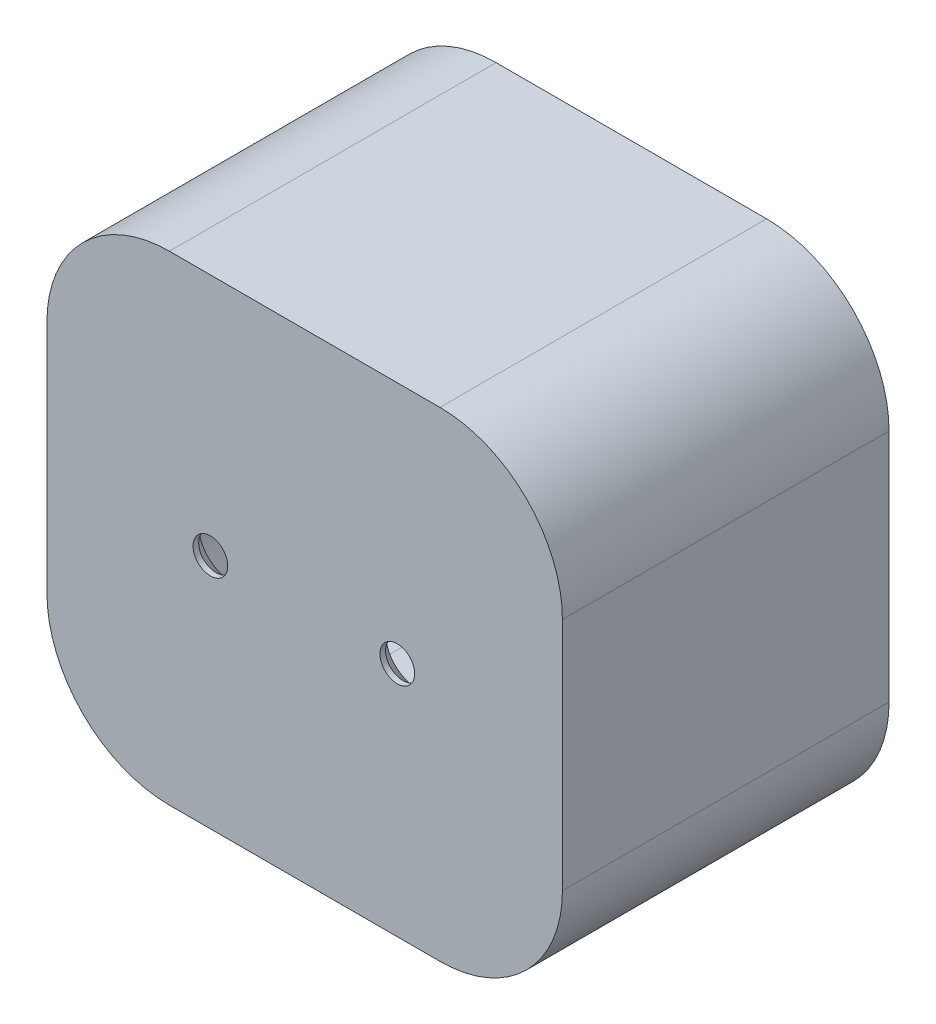
ISO-10303-21;
HEADER;
FILE_DESCRIPTION(('STEP AP214'),'2;1');
FILE_NAME('part.step','',(''),(''),'','','');
FILE_SCHEMA(('AUTOMOTIVE_DESIGN { 1 0 10303 214 1 1 1 1 }'));
ENDSEC;
DATA;
#1=APPLICATION_CONTEXT('core data for automotive mechanical design processes');
#2=APPLICATION_PROTOCOL_DEFINITION('international standard','automotive_design',2000,#1);
#3=PRODUCT_CONTEXT('',#1,'mechanical');
#4=PRODUCT('Part','Part','',(#3));
#5=PRODUCT_RELATED_PRODUCT_CATEGORY('part','',(#4));
#6=PRODUCT_DEFINITION_FORMATION('','',#4);
#7=PRODUCT_DEFINITION_CONTEXT('part definition',#1,'design');
#8=PRODUCT_DEFINITION('design','',#6,#7);
#9=PRODUCT_DEFINITION_SHAPE('','',#8);
#10=(LENGTH_UNIT() NAMED_UNIT(*) SI_UNIT(.MILLI.,.METRE.));
#11=(NAMED_UNIT(*) PLANE_ANGLE_UNIT() SI_UNIT($,.RADIAN.));
#12=(NAMED_UNIT(*) SI_UNIT($,.STERADIAN.) SOLID_ANGLE_UNIT());
#13=UNCERTAINTY_MEASURE_WITH_UNIT(LENGTH_MEASURE(1.E-05),#10,'distance_accuracy_value','');
#14=(GEOMETRIC_REPRESENTATION_CONTEXT(3) GLOBAL_UNCERTAINTY_ASSIGNED_CONTEXT((#13)) GLOBAL_UNIT_ASSIGNED_CONTEXT((#10,
#11,#12)) REPRESENTATION_CONTEXT('',''));
#15=CARTESIAN_POINT('',(0.,0.,0.));
#16=DIRECTION('',(0.,0.,1.));
#17=DIRECTION('',(1.,0.,0.));
#18=AXIS2_PLACEMENT_3D('',#15,#16,#17);
#19=CARTESIAN_POINT('',(-36.5,33.,30.));
#20=DIRECTION('',(0.,0.,-1.));
#21=DIRECTION('',(-1.,0.,0.));
#22=AXIS2_PLACEMENT_3D('',#19,#20,#21);
#23=CYLINDRICAL_SURFACE('',#22,12.);
#24=CARTESIAN_POINT('',(-36.5,33.,0.));
#25=DIRECTION('',(0.,0.,1.));
#26=DIRECTION('',(1.,0.,0.));
#27=AXIS2_PLACEMENT_3D('',#24,#25,#26);
#28=CIRCLE('',#27,12.);
#29=CARTESIAN_POINT('',(-36.4999999999999,45.,0.));
#30=VERTEX_POINT('',#29);
#31=CARTESIAN_POINT('',(-48.5,32.9999999999999,0.));
#32=VERTEX_POINT('',#31);
#33=EDGE_CURVE('E171',#30,#32,#28,.T.);
#34=ORIENTED_EDGE('',*,*,#33,.T.);
#35=DIRECTION('',(0.,0.,-1.));
#36=VECTOR('',#35,1.);
#37=CARTESIAN_POINT('',(-48.5,32.9999999999999,30.));
#38=LINE('',#37,#36);
#39=CARTESIAN_POINT('',(-48.5,32.9999999999999,32.));
#40=VERTEX_POINT('',#39);
#41=EDGE_CURVE('E11',#40,#32,#38,.T.);
#42=ORIENTED_EDGE('',*,*,#41,.F.);
#43=CARTESIAN_POINT('',(-36.5,33.,32.));
#44=DIRECTION('',(0.,0.,1.));
#45=DIRECTION('',(1.,0.,0.));
#46=AXIS2_PLACEMENT_3D('',#43,#44,#45);
#47=CIRCLE('',#46,12.);
#48=CARTESIAN_POINT('',(-36.4999999999999,45.,32.));
#49=VERTEX_POINT('',#48);
#50=EDGE_CURVE('E177',#49,#40,#47,.T.);
#51=ORIENTED_EDGE('',*,*,#50,.F.);
#52=DIRECTION('',(0.,0.,-1.));
#53=VECTOR('',#52,1.);
#54=CARTESIAN_POINT('',(-36.4999999999999,45.,30.));
#55=LINE('',#54,#53);
#56=EDGE_CURVE('E167',#49,#30,#55,.T.);
#57=ORIENTED_EDGE('',*,*,#56,.T.);
#58=EDGE_LOOP('',(#34,#42,#51,#57));
#59=FACE_BOUND('',#58,.T.);
#60=ADVANCED_FACE('F35',(#59),#23,.T.);
#61=CARTESIAN_POINT('',(-48.5,10.0000000000001,30.));
#62=DIRECTION('',(1.,0.,0.));
#63=DIRECTION('',(0.,0.,-1.));
#64=AXIS2_PLACEMENT_3D('',#61,#62,#63);
#65=PLANE('',#64);
#66=DIRECTION('',(0.,-1.,0.));
#67=VECTOR('',#66,1.);
#68=CARTESIAN_POINT('',(-48.5,10.0000000000001,0.));
#69=LINE('',#68,#67);
#70=CARTESIAN_POINT('',(-48.5,9.99999999999999,0.));
#71=VERTEX_POINT('',#70);
#72=EDGE_CURVE('E39',#32,#71,#69,.T.);
#73=ORIENTED_EDGE('',*,*,#72,.T.);
#74=DIRECTION('',(0.,0.,-1.));
#75=VECTOR('',#74,1.);
#76=CARTESIAN_POINT('',(-48.5,9.99999999999999,30.));
#77=LINE('',#76,#75);
#78=CARTESIAN_POINT('',(-48.5,9.99999999999999,32.));
#79=VERTEX_POINT('',#78);
#80=EDGE_CURVE('E44',#79,#71,#77,.T.);
#81=ORIENTED_EDGE('',*,*,#80,.F.);
#82=DIRECTION('',(0.,-1.,0.));
#83=VECTOR('',#82,1.);
#84=CARTESIAN_POINT('',(-48.5,10.0000000000001,32.));
#85=LINE('',#84,#83);
#86=EDGE_CURVE('E216',#40,#79,#85,.T.);
#87=ORIENTED_EDGE('',*,*,#86,.F.);
#88=ORIENTED_EDGE('',*,*,#41,.T.);
#89=EDGE_LOOP('',(#73,#81,#87,#88));
#90=FACE_BOUND('',#89,.T.);
#91=ADVANCED_FACE('F191',(#90),#65,.F.);
#92=CARTESIAN_POINT('',(-36.5,9.99999999999999,30.));
#93=DIRECTION('',(0.,0.,-1.));
#94=DIRECTION('',(-1.,0.,0.));
#95=AXIS2_PLACEMENT_3D('',#92,#93,#94);
#96=CYLINDRICAL_SURFACE('',#95,12.);
#97=CARTESIAN_POINT('',(-36.5,9.99999999999999,0.));
#98=DIRECTION('',(0.,0.,1.));
#99=DIRECTION('',(1.,0.,0.));
#100=AXIS2_PLACEMENT_3D('',#97,#98,#99);
#101=CIRCLE('',#100,12.);
#102=CARTESIAN_POINT('',(-36.4999999999999,-2.,0.));
#103=VERTEX_POINT('',#102);
#104=EDGE_CURVE('E184',#71,#103,#101,.T.);
#105=ORIENTED_EDGE('',*,*,#104,.T.);
#106=DIRECTION('',(0.,0.,1.));
#107=VECTOR('',#106,1.);
#108=CARTESIAN_POINT('',(-36.4999999999999,-2.00000000000001,30.));
#109=LINE('',#108,#107);
#110=CARTESIAN_POINT('',(-36.4999999999999,-2.00000000000001,32.));
#111=VERTEX_POINT('',#110);
#112=EDGE_CURVE('E196',#111,#103,#109,.F.);
#113=ORIENTED_EDGE('',*,*,#112,.F.);
#114=CARTESIAN_POINT('',(-36.5,9.99999999999999,32.));
#115=DIRECTION('',(0.,0.,1.));
#116=DIRECTION('',(1.,0.,0.));
#117=AXIS2_PLACEMENT_3D('',#114,#115,#116);
#118=CIRCLE('',#117,12.);
#119=EDGE_CURVE('E195',#79,#111,#118,.T.);
#120=ORIENTED_EDGE('',*,*,#119,.F.);
#121=ORIENTED_EDGE('',*,*,#80,.T.);
#122=EDGE_LOOP('',(#105,#113,#120,#121));
#123=FACE_BOUND('',#122,.T.);
#124=ADVANCED_FACE('F194',(#123),#96,.T.);
#125=CARTESIAN_POINT('',(-10.0000000000001,-2.,30.));
#126=DIRECTION('',(0.,1.,0.));
#127=DIRECTION('',(-1.,0.,0.));
#128=AXIS2_PLACEMENT_3D('',#125,#126,#127);
#129=PLANE('',#128);
#130=DIRECTION('',(1.,0.,0.));
#131=VECTOR('',#130,1.);
#132=CARTESIAN_POINT('',(-10.0000000000001,-2.,0.));
#133=LINE('',#132,#131);
#134=CARTESIAN_POINT('',(-10.0000000000001,-2.,0.));
#135=VERTEX_POINT('',#134);
#136=EDGE_CURVE('E183',#103,#135,#133,.T.);
#137=ORIENTED_EDGE('',*,*,#136,.T.);
#138=DIRECTION('',(0.,0.,-1.));
#139=VECTOR('',#138,1.);
#140=CARTESIAN_POINT('',(-10.0000000000001,-2.,30.));
#141=LINE('',#140,#139);
#142=CARTESIAN_POINT('',(-10.0000000000001,-2.,32.));
#143=VERTEX_POINT('',#142);
#144=EDGE_CURVE('E206',#143,#135,#141,.T.);
#145=ORIENTED_EDGE('',*,*,#144,.F.);
#146=DIRECTION('',(1.,0.,0.));
#147=VECTOR('',#146,1.);
#148=CARTESIAN_POINT('',(-10.0000000000001,-2.,32.));
#149=LINE('',#148,#147);
#150=EDGE_CURVE('E214',#111,#143,#149,.T.);
#151=ORIENTED_EDGE('',*,*,#150,.F.);
#152=ORIENTED_EDGE('',*,*,#112,.T.);
#153=EDGE_LOOP('',(#137,#145,#151,#152));
#154=FACE_BOUND('',#153,.T.);
#155=ADVANCED_FACE('F204',(#154),#129,.F.);
#156=CARTESIAN_POINT('',(-10.,10.,30.));
#157=DIRECTION('',(0.,0.,-1.));
#158=DIRECTION('',(-1.,0.,0.));
#159=AXIS2_PLACEMENT_3D('',#156,#157,#158);
#160=CYLINDRICAL_SURFACE('',#159,12.);
#161=CARTESIAN_POINT('',(-10.,10.,0.));
#162=DIRECTION('',(0.,0.,1.));
#163=DIRECTION('',(1.,0.,0.));
#164=AXIS2_PLACEMENT_3D('',#161,#162,#163);
#165=CIRCLE('',#164,12.);
#166=CARTESIAN_POINT('',(2.,10.0000000000001,0.));
#167=VERTEX_POINT('',#166);
#168=EDGE_CURVE('E181',#135,#167,#165,.T.);
#169=ORIENTED_EDGE('',*,*,#168,.T.);
#170=DIRECTION('',(0.,0.,1.));
#171=VECTOR('',#170,1.);
#172=CARTESIAN_POINT('',(2.,10.0000000000001,30.));
#173=LINE('',#172,#171);
#174=CARTESIAN_POINT('',(2.,10.0000000000001,32.));
#175=VERTEX_POINT('',#174);
#176=EDGE_CURVE('E161',#175,#167,#173,.F.);
#177=ORIENTED_EDGE('',*,*,#176,.F.);
#178=CARTESIAN_POINT('',(-10.,10.,32.));
#179=DIRECTION('',(0.,0.,1.));
#180=DIRECTION('',(1.,0.,0.));
#181=AXIS2_PLACEMENT_3D('',#178,#179,#180);
#182=CIRCLE('',#181,12.);
#183=EDGE_CURVE('E149',#143,#175,#182,.T.);
#184=ORIENTED_EDGE('',*,*,#183,.F.);
#185=ORIENTED_EDGE('',*,*,#144,.T.);
#186=EDGE_LOOP('',(#169,#177,#184,#185));
#187=FACE_BOUND('',#186,.T.);
#188=ADVANCED_FACE('F208',(#187),#160,.T.);
#189=CARTESIAN_POINT('',(2.,10.0000000000001,30.));
#190=DIRECTION('',(-1.,0.,0.));
#191=DIRECTION('',(0.,0.,1.));
#192=AXIS2_PLACEMENT_3D('',#189,#190,#191);
#193=PLANE('',#192);
#194=DIRECTION('',(0.,1.,0.));
#195=VECTOR('',#194,1.);
#196=CARTESIAN_POINT('',(2.,10.0000000000001,0.));
#197=LINE('',#196,#195);
#198=CARTESIAN_POINT('',(2.,32.9999999999999,0.));
#199=VERTEX_POINT('',#198);
#200=EDGE_CURVE('E158',#167,#199,#197,.T.);
#201=ORIENTED_EDGE('',*,*,#200,.T.);
#202=DIRECTION('',(0.,0.,-1.));
#203=VECTOR('',#202,1.);
#204=CARTESIAN_POINT('',(2.,32.9999999999999,30.));
#205=LINE('',#204,#203);
#206=CARTESIAN_POINT('',(2.,32.9999999999999,32.));
#207=VERTEX_POINT('',#206);
#208=EDGE_CURVE('E155',#207,#199,#205,.T.);
#209=ORIENTED_EDGE('',*,*,#208,.F.);
#210=DIRECTION('',(0.,1.,0.));
#211=VECTOR('',#210,1.);
#212=CARTESIAN_POINT('',(2.,10.0000000000001,32.));
#213=LINE('',#212,#211);
#214=EDGE_CURVE('E143',#175,#207,#213,.T.);
#215=ORIENTED_EDGE('',*,*,#214,.F.);
#216=ORIENTED_EDGE('',*,*,#176,.T.);
#217=EDGE_LOOP('',(#201,#209,#215,#216));
#218=FACE_BOUND('',#217,.T.);
#219=ADVANCED_FACE('F156',(#218),#193,.F.);
#220=CARTESIAN_POINT('',(-10.,33.,30.));
#221=DIRECTION('',(0.,0.,-1.));
#222=DIRECTION('',(-1.,0.,0.));
#223=AXIS2_PLACEMENT_3D('',#220,#221,#222);
#224=CYLINDRICAL_SURFACE('',#223,12.);
#225=CARTESIAN_POINT('',(-10.,33.,0.));
#226=DIRECTION('',(0.,0.,1.));
#227=DIRECTION('',(1.,0.,0.));
#228=AXIS2_PLACEMENT_3D('',#225,#226,#227);
#229=CIRCLE('',#228,12.);
#230=CARTESIAN_POINT('',(-10.0000000000001,45.,0.));
#231=VERTEX_POINT('',#230);
#232=EDGE_CURVE('E178',#199,#231,#229,.T.);
#233=ORIENTED_EDGE('',*,*,#232,.T.);
#234=DIRECTION('',(0.,0.,1.));
#235=VECTOR('',#234,1.);
#236=CARTESIAN_POINT('',(-10.0000000000001,45.,30.));
#237=LINE('',#236,#235);
#238=CARTESIAN_POINT('',(-10.0000000000001,45.,32.));
#239=VERTEX_POINT('',#238);
#240=EDGE_CURVE('E162',#239,#231,#237,.F.);
#241=ORIENTED_EDGE('',*,*,#240,.F.);
#242=CARTESIAN_POINT('',(-10.,33.,32.));
#243=DIRECTION('',(0.,0.,1.));
#244=DIRECTION('',(1.,0.,0.));
#245=AXIS2_PLACEMENT_3D('',#242,#243,#244);
#246=CIRCLE('',#245,12.);
#247=EDGE_CURVE('E146',#207,#239,#246,.T.);
#248=ORIENTED_EDGE('',*,*,#247,.F.);
#249=ORIENTED_EDGE('',*,*,#208,.T.);
#250=EDGE_LOOP('',(#233,#241,#248,#249));
#251=FACE_BOUND('',#250,.T.);
#252=ADVANCED_FACE('F164',(#251),#224,.T.);
#253=CARTESIAN_POINT('',(-10.0000000000001,45.,30.));
#254=DIRECTION('',(0.,-1.,0.));
#255=DIRECTION('',(1.,0.,0.));
#256=AXIS2_PLACEMENT_3D('',#253,#254,#255);
#257=PLANE('',#256);
#258=DIRECTION('',(-1.,0.,0.));
#259=VECTOR('',#258,1.);
#260=CARTESIAN_POINT('',(-10.0000000000001,45.,0.));
#261=LINE('',#260,#259);
#262=EDGE_CURVE('E175',#231,#30,#261,.T.);
#263=ORIENTED_EDGE('',*,*,#262,.T.);
#264=ORIENTED_EDGE('',*,*,#56,.F.);
#265=DIRECTION('',(-1.,0.,0.));
#266=VECTOR('',#265,1.);
#267=CARTESIAN_POINT('',(-10.0000000000001,45.,32.));
#268=LINE('',#267,#266);
#269=EDGE_CURVE('E61',#239,#49,#268,.T.);
#270=ORIENTED_EDGE('',*,*,#269,.F.);
#271=ORIENTED_EDGE('',*,*,#240,.T.);
#272=EDGE_LOOP('',(#263,#264,#270,#271));
#273=FACE_BOUND('',#272,.T.);
#274=ADVANCED_FACE('F378',(#273),#257,.F.);
#275=CARTESIAN_POINT('',(-36.5,33.,32.));
#276=DIRECTION('',(0.,0.,1.));
#277=DIRECTION('',(1.,0.,0.));
#278=AXIS2_PLACEMENT_3D('',#275,#276,#277);
#279=PLANE('',#278);
#280=CARTESIAN_POINT('',(-32.4851185797025,21.1581560329257,32.));
#281=DIRECTION('',(0.,0.,-1.));
#282=DIRECTION('',(-1.,0.,0.));
#283=AXIS2_PLACEMENT_3D('',#280,#281,#282);
#284=CIRCLE('',#283,1.7);
#285=CARTESIAN_POINT('',(-34.1851185797025,21.1581560329257,32.));
#286=VERTEX_POINT('',#285);
#287=EDGE_CURVE('E290',#286,#286,#284,.T.);
#288=ORIENTED_EDGE('',*,*,#287,.T.);
#289=EDGE_LOOP('',(#288));
#290=FACE_BOUND('',#289,.T.);
#291=CARTESIAN_POINT('',(-14.1764307757685,21.1581560329257,32.));
#292=DIRECTION('',(0.,0.,-1.));
#293=DIRECTION('',(-1.,0.,0.));
#294=AXIS2_PLACEMENT_3D('',#291,#292,#293);
#295=CIRCLE('',#294,1.7);
#296=CARTESIAN_POINT('',(-15.8764307757685,21.1581560329257,32.));
#297=VERTEX_POINT('',#296);
#298=EDGE_CURVE('E261',#297,#297,#295,.T.);
#299=ORIENTED_EDGE('',*,*,#298,.T.);
#300=EDGE_LOOP('',(#299));
#301=FACE_BOUND('',#300,.T.);
#302=ORIENTED_EDGE('',*,*,#50,.T.);
#303=ORIENTED_EDGE('',*,*,#86,.T.);
#304=ORIENTED_EDGE('',*,*,#119,.T.);
#305=ORIENTED_EDGE('',*,*,#150,.T.);
#306=ORIENTED_EDGE('',*,*,#183,.T.);
#307=ORIENTED_EDGE('',*,*,#214,.T.);
#308=ORIENTED_EDGE('',*,*,#247,.T.);
#309=ORIENTED_EDGE('',*,*,#269,.T.);
#310=EDGE_LOOP('',(#302,#303,#304,#305,#306,#307,#308,#309));
#311=FACE_BOUND('',#310,.T.);
#312=ADVANCED_FACE('F37',(#290,#301,#311),#279,.T.);
#313=CARTESIAN_POINT('',(-36.5,33.,0.));
#314=DIRECTION('',(0.,0.,1.));
#315=DIRECTION('',(1.,0.,0.));
#316=AXIS2_PLACEMENT_3D('',#313,#314,#315);
#317=PLANE('',#316);
#318=DIRECTION('',(-1.,0.,0.));
#319=VECTOR('',#318,1.);
#320=CARTESIAN_POINT('',(-10.0000000000001,43.,0.));
#321=LINE('',#320,#319);
#322=CARTESIAN_POINT('',(-10.0000000000001,43.,0.));
#323=VERTEX_POINT('',#322);
#324=CARTESIAN_POINT('',(-36.4999999999999,43.,0.));
#325=VERTEX_POINT('',#324);
#326=EDGE_CURVE('E238',#323,#325,#321,.T.);
#327=ORIENTED_EDGE('',*,*,#326,.T.);
#328=CARTESIAN_POINT('',(-36.5,33.,0.));
#329=DIRECTION('',(0.,0.,1.));
#330=DIRECTION('',(1.,0.,0.));
#331=AXIS2_PLACEMENT_3D('',#328,#329,#330);
#332=CIRCLE('',#331,10.);
#333=CARTESIAN_POINT('',(-46.5,32.9999999999999,0.));
#334=VERTEX_POINT('',#333);
#335=EDGE_CURVE('E258',#325,#334,#332,.T.);
#336=ORIENTED_EDGE('',*,*,#335,.T.);
#337=DIRECTION('',(0.,-1.,0.));
#338=VECTOR('',#337,1.);
#339=CARTESIAN_POINT('',(-46.5,10.0000000000001,0.));
#340=LINE('',#339,#338);
#341=CARTESIAN_POINT('',(-46.5,9.99999999999999,0.));
#342=VERTEX_POINT('',#341);
#343=EDGE_CURVE('E255',#334,#342,#340,.T.);
#344=ORIENTED_EDGE('',*,*,#343,.T.);
#345=CARTESIAN_POINT('',(-36.5,9.99999999999999,0.));
#346=DIRECTION('',(0.,0.,1.));
#347=DIRECTION('',(-1.,0.,0.));
#348=AXIS2_PLACEMENT_3D('',#345,#346,#347);
#349=CIRCLE('',#348,10.);
#350=CARTESIAN_POINT('',(-36.4999999999999,0.,0.));
#351=VERTEX_POINT('',#350);
#352=EDGE_CURVE('E52',#342,#351,#349,.T.);
#353=ORIENTED_EDGE('',*,*,#352,.T.);
#354=DIRECTION('',(1.,0.,0.));
#355=VECTOR('',#354,1.);
#356=CARTESIAN_POINT('',(-10.0000000000001,0.,0.));
#357=LINE('',#356,#355);
#358=CARTESIAN_POINT('',(-10.0000000000001,0.,0.));
#359=VERTEX_POINT('',#358);
#360=EDGE_CURVE('E251',#351,#359,#357,.T.);
#361=ORIENTED_EDGE('',*,*,#360,.T.);
#362=CARTESIAN_POINT('',(-10.,10.,0.));
#363=DIRECTION('',(0.,0.,1.));
#364=DIRECTION('',(1.,0.,0.));
#365=AXIS2_PLACEMENT_3D('',#362,#363,#364);
#366=CIRCLE('',#365,10.);
#367=CARTESIAN_POINT('',(0.,10.0000000000001,0.));
#368=VERTEX_POINT('',#367);
#369=EDGE_CURVE('E248',#359,#368,#366,.T.);
#370=ORIENTED_EDGE('',*,*,#369,.T.);
#371=DIRECTION('',(0.,1.,0.));
#372=VECTOR('',#371,1.);
#373=CARTESIAN_POINT('',(0.,10.0000000000001,0.));
#374=LINE('',#373,#372);
#375=CARTESIAN_POINT('',(0.,32.9999999999999,0.));
#376=VERTEX_POINT('',#375);
#377=EDGE_CURVE('E245',#368,#376,#374,.T.);
#378=ORIENTED_EDGE('',*,*,#377,.T.);
#379=CARTESIAN_POINT('',(-10.,33.,0.));
#380=DIRECTION('',(0.,0.,1.));
#381=DIRECTION('',(1.,0.,0.));
#382=AXIS2_PLACEMENT_3D('',#379,#380,#381);
#383=CIRCLE('',#382,10.);
#384=EDGE_CURVE('E242',#376,#323,#383,.T.);
#385=ORIENTED_EDGE('',*,*,#384,.T.);
#386=EDGE_LOOP('',(#327,#336,#344,#353,#361,#370,#378,#385));
#387=FACE_BOUND('',#386,.T.);
#388=ORIENTED_EDGE('',*,*,#33,.F.);
#389=ORIENTED_EDGE('',*,*,#262,.F.);
#390=ORIENTED_EDGE('',*,*,#232,.F.);
#391=ORIENTED_EDGE('',*,*,#200,.F.);
#392=ORIENTED_EDGE('',*,*,#168,.F.);
#393=ORIENTED_EDGE('',*,*,#136,.F.);
#394=ORIENTED_EDGE('',*,*,#104,.F.);
#395=ORIENTED_EDGE('',*,*,#72,.F.);
#396=EDGE_LOOP('',(#388,#389,#390,#391,#392,#393,#394,#395));
#397=FACE_BOUND('',#396,.T.);
#398=ADVANCED_FACE('F199',(#387,#397),#317,.F.);
#399=CARTESIAN_POINT('',(-36.5,33.,30.));
#400=DIRECTION('',(0.,0.,-1.));
#401=DIRECTION('',(-1.,0.,0.));
#402=AXIS2_PLACEMENT_3D('',#399,#400,#401);
#403=CYLINDRICAL_SURFACE('',#402,10.);
#404=ORIENTED_EDGE('',*,*,#335,.F.);
#405=DIRECTION('',(0.,0.,-1.));
#406=VECTOR('',#405,1.);
#407=CARTESIAN_POINT('',(-36.4999999999999,43.,30.));
#408=LINE('',#407,#406);
#409=CARTESIAN_POINT('',(-36.4999999999999,43.,30.));
#410=VERTEX_POINT('',#409);
#411=EDGE_CURVE('E236',#410,#325,#408,.T.);
#412=ORIENTED_EDGE('',*,*,#411,.F.);
#413=CARTESIAN_POINT('',(-36.5,33.,30.));
#414=DIRECTION('',(0.,0.,1.));
#415=DIRECTION('',(1.,0.,0.));
#416=AXIS2_PLACEMENT_3D('',#413,#414,#415);
#417=CIRCLE('',#416,10.);
#418=CARTESIAN_POINT('',(-46.5,32.9999999999999,30.));
#419=VERTEX_POINT('',#418);
#420=EDGE_CURVE('E241',#410,#419,#417,.T.);
#421=ORIENTED_EDGE('',*,*,#420,.T.);
#422=DIRECTION('',(0.,0.,-1.));
#423=VECTOR('',#422,1.);
#424=CARTESIAN_POINT('',(-46.5,32.9999999999999,30.));
#425=LINE('',#424,#423);
#426=EDGE_CURVE('E174',#419,#334,#425,.T.);
#427=ORIENTED_EDGE('',*,*,#426,.T.);
#428=EDGE_LOOP('',(#404,#412,#421,#427));
#429=FACE_BOUND('',#428,.T.);
#430=ADVANCED_FACE('F317',(#429),#403,.F.);
#431=CARTESIAN_POINT('',(-46.5,10.0000000000001,30.));
#432=DIRECTION('',(1.,0.,0.));
#433=DIRECTION('',(0.,0.,-1.));
#434=AXIS2_PLACEMENT_3D('',#431,#432,#433);
#435=PLANE('',#434);
#436=ORIENTED_EDGE('',*,*,#343,.F.);
#437=ORIENTED_EDGE('',*,*,#426,.F.);
#438=DIRECTION('',(0.,-1.,0.));
#439=VECTOR('',#438,1.);
#440=CARTESIAN_POINT('',(-46.5,10.0000000000001,30.));
#441=LINE('',#440,#439);
#442=CARTESIAN_POINT('',(-46.5,9.99999999999999,30.));
#443=VERTEX_POINT('',#442);
#444=EDGE_CURVE('E277',#419,#443,#441,.T.);
#445=ORIENTED_EDGE('',*,*,#444,.T.);
#446=DIRECTION('',(0.,0.,-1.));
#447=VECTOR('',#446,1.);
#448=CARTESIAN_POINT('',(-46.5,9.99999999999999,30.));
#449=LINE('',#448,#447);
#450=EDGE_CURVE('E224',#443,#342,#449,.T.);
#451=ORIENTED_EDGE('',*,*,#450,.T.);
#452=EDGE_LOOP('',(#436,#437,#445,#451));
#453=FACE_BOUND('',#452,.T.);
#454=ADVANCED_FACE('F321',(#453),#435,.T.);
#455=CARTESIAN_POINT('',(-36.5,9.99999999999999,30.));
#456=DIRECTION('',(0.,0.,-1.));
#457=DIRECTION('',(-1.,0.,0.));
#458=AXIS2_PLACEMENT_3D('',#455,#456,#457);
#459=CYLINDRICAL_SURFACE('',#458,10.);
#460=ORIENTED_EDGE('',*,*,#352,.F.);
#461=ORIENTED_EDGE('',*,*,#450,.F.);
#462=CARTESIAN_POINT('',(-36.5,9.99999999999999,30.));
#463=DIRECTION('',(0.,0.,1.));
#464=DIRECTION('',(-1.,0.,0.));
#465=AXIS2_PLACEMENT_3D('',#462,#463,#464);
#466=CIRCLE('',#465,10.);
#467=CARTESIAN_POINT('',(-36.4999999999999,0.,30.));
#468=VERTEX_POINT('',#467);
#469=EDGE_CURVE('E274',#443,#468,#466,.T.);
#470=ORIENTED_EDGE('',*,*,#469,.T.);
#471=DIRECTION('',(0.,0.,-1.));
#472=VECTOR('',#471,1.);
#473=CARTESIAN_POINT('',(-36.4999999999999,0.,30.));
#474=LINE('',#473,#472);
#475=EDGE_CURVE('E226',#468,#351,#474,.T.);
#476=ORIENTED_EDGE('',*,*,#475,.T.);
#477=EDGE_LOOP('',(#460,#461,#470,#476));
#478=FACE_BOUND('',#477,.T.);
#479=ADVANCED_FACE('F340',(#478),#459,.F.);
#480=CARTESIAN_POINT('',(-10.0000000000001,0.,30.));
#481=DIRECTION('',(0.,1.,0.));
#482=DIRECTION('',(-1.,0.,0.));
#483=AXIS2_PLACEMENT_3D('',#480,#481,#482);
#484=PLANE('',#483);
#485=ORIENTED_EDGE('',*,*,#360,.F.);
#486=ORIENTED_EDGE('',*,*,#475,.F.);
#487=DIRECTION('',(1.,0.,0.));
#488=VECTOR('',#487,1.);
#489=CARTESIAN_POINT('',(-10.0000000000001,0.,30.));
#490=LINE('',#489,#488);
#491=CARTESIAN_POINT('',(-10.0000000000001,0.,30.));
#492=VERTEX_POINT('',#491);
#493=EDGE_CURVE('E271',#468,#492,#490,.T.);
#494=ORIENTED_EDGE('',*,*,#493,.T.);
#495=DIRECTION('',(0.,0.,-1.));
#496=VECTOR('',#495,1.);
#497=CARTESIAN_POINT('',(-10.0000000000001,0.,30.));
#498=LINE('',#497,#496);
#499=EDGE_CURVE('E228',#492,#359,#498,.T.);
#500=ORIENTED_EDGE('',*,*,#499,.T.);
#501=EDGE_LOOP('',(#485,#486,#494,#500));
#502=FACE_BOUND('',#501,.T.);
#503=ADVANCED_FACE('F344',(#502),#484,.T.);
#504=CARTESIAN_POINT('',(-10.,10.,30.));
#505=DIRECTION('',(0.,0.,-1.));
#506=DIRECTION('',(-1.,0.,0.));
#507=AXIS2_PLACEMENT_3D('',#504,#505,#506);
#508=CYLINDRICAL_SURFACE('',#507,10.);
#509=ORIENTED_EDGE('',*,*,#369,.F.);
#510=ORIENTED_EDGE('',*,*,#499,.F.);
#511=CARTESIAN_POINT('',(-10.,10.,30.));
#512=DIRECTION('',(0.,0.,1.));
#513=DIRECTION('',(1.,0.,0.));
#514=AXIS2_PLACEMENT_3D('',#511,#512,#513);
#515=CIRCLE('',#514,10.);
#516=CARTESIAN_POINT('',(0.,10.0000000000001,30.));
#517=VERTEX_POINT('',#516);
#518=EDGE_CURVE('E268',#492,#517,#515,.T.);
#519=ORIENTED_EDGE('',*,*,#518,.T.);
#520=DIRECTION('',(0.,0.,-1.));
#521=VECTOR('',#520,1.);
#522=CARTESIAN_POINT('',(0.,10.0000000000001,30.));
#523=LINE('',#522,#521);
#524=EDGE_CURVE('E230',#517,#368,#523,.T.);
#525=ORIENTED_EDGE('',*,*,#524,.T.);
#526=EDGE_LOOP('',(#509,#510,#519,#525));
#527=FACE_BOUND('',#526,.T.);
#528=ADVANCED_FACE('F348',(#527),#508,.F.);
#529=CARTESIAN_POINT('',(0.,10.0000000000001,30.));
#530=DIRECTION('',(-1.,0.,0.));
#531=DIRECTION('',(0.,0.,1.));
#532=AXIS2_PLACEMENT_3D('',#529,#530,#531);
#533=PLANE('',#532);
#534=ORIENTED_EDGE('',*,*,#377,.F.);
#535=ORIENTED_EDGE('',*,*,#524,.F.);
#536=DIRECTION('',(0.,1.,0.));
#537=VECTOR('',#536,1.);
#538=CARTESIAN_POINT('',(0.,10.0000000000001,30.));
#539=LINE('',#538,#537);
#540=CARTESIAN_POINT('',(0.,32.9999999999999,30.));
#541=VERTEX_POINT('',#540);
#542=EDGE_CURVE('E265',#517,#541,#539,.T.);
#543=ORIENTED_EDGE('',*,*,#542,.T.);
#544=DIRECTION('',(0.,0.,-1.));
#545=VECTOR('',#544,1.);
#546=CARTESIAN_POINT('',(0.,32.9999999999999,30.));
#547=LINE('',#546,#545);
#548=EDGE_CURVE('E232',#541,#376,#547,.T.);
#549=ORIENTED_EDGE('',*,*,#548,.T.);
#550=EDGE_LOOP('',(#534,#535,#543,#549));
#551=FACE_BOUND('',#550,.T.);
#552=ADVANCED_FACE('F350',(#551),#533,.T.);
#553=CARTESIAN_POINT('',(-10.,33.,30.));
#554=DIRECTION('',(0.,0.,-1.));
#555=DIRECTION('',(-1.,0.,0.));
#556=AXIS2_PLACEMENT_3D('',#553,#554,#555);
#557=CYLINDRICAL_SURFACE('',#556,10.);
#558=ORIENTED_EDGE('',*,*,#384,.F.);
#559=ORIENTED_EDGE('',*,*,#548,.F.);
#560=CARTESIAN_POINT('',(-10.,33.,30.));
#561=DIRECTION('',(0.,0.,1.));
#562=DIRECTION('',(1.,0.,0.));
#563=AXIS2_PLACEMENT_3D('',#560,#561,#562);
#564=CIRCLE('',#563,10.);
#565=CARTESIAN_POINT('',(-10.0000000000001,43.,30.));
#566=VERTEX_POINT('',#565);
#567=EDGE_CURVE('E263',#541,#566,#564,.T.);
#568=ORIENTED_EDGE('',*,*,#567,.T.);
#569=DIRECTION('',(0.,0.,-1.));
#570=VECTOR('',#569,1.);
#571=CARTESIAN_POINT('',(-10.0000000000001,43.,30.));
#572=LINE('',#571,#570);
#573=EDGE_CURVE('E234',#566,#323,#572,.T.);
#574=ORIENTED_EDGE('',*,*,#573,.T.);
#575=EDGE_LOOP('',(#558,#559,#568,#574));
#576=FACE_BOUND('',#575,.T.);
#577=ADVANCED_FACE('F326',(#576),#557,.F.);
#578=CARTESIAN_POINT('',(-10.0000000000001,43.,30.));
#579=DIRECTION('',(0.,-1.,0.));
#580=DIRECTION('',(1.,0.,0.));
#581=AXIS2_PLACEMENT_3D('',#578,#579,#580);
#582=PLANE('',#581);
#583=ORIENTED_EDGE('',*,*,#326,.F.);
#584=ORIENTED_EDGE('',*,*,#573,.F.);
#585=DIRECTION('',(-1.,0.,0.));
#586=VECTOR('',#585,1.);
#587=CARTESIAN_POINT('',(-10.0000000000001,43.,30.));
#588=LINE('',#587,#586);
#589=EDGE_CURVE('E101',#566,#410,#588,.T.);
#590=ORIENTED_EDGE('',*,*,#589,.T.);
#591=ORIENTED_EDGE('',*,*,#411,.T.);
#592=EDGE_LOOP('',(#583,#584,#590,#591));
#593=FACE_BOUND('',#592,.T.);
#594=ADVANCED_FACE('F306',(#593),#582,.T.);
#595=CARTESIAN_POINT('',(-36.5,33.,30.));
#596=DIRECTION('',(0.,0.,1.));
#597=DIRECTION('',(1.,0.,0.));
#598=AXIS2_PLACEMENT_3D('',#595,#596,#597);
#599=PLANE('',#598);
#600=CARTESIAN_POINT('',(-32.4851185797025,21.1581560329257,30.));
#601=DIRECTION('',(0.,0.,-1.));
#602=DIRECTION('',(-1.,0.,0.));
#603=AXIS2_PLACEMENT_3D('',#600,#601,#602);
#604=CIRCLE('',#603,3.15);
#605=CARTESIAN_POINT('',(-35.6351185797025,21.1581560329257,30.));
#606=VERTEX_POINT('',#605);
#607=EDGE_CURVE('E296',#606,#606,#604,.T.);
#608=ORIENTED_EDGE('',*,*,#607,.F.);
#609=EDGE_LOOP('',(#608));
#610=FACE_BOUND('',#609,.T.);
#611=CARTESIAN_POINT('',(-14.1764307757685,21.1581560329257,30.));
#612=DIRECTION('',(0.,0.,-1.));
#613=DIRECTION('',(-1.,0.,0.));
#614=AXIS2_PLACEMENT_3D('',#611,#612,#613);
#615=CIRCLE('',#614,3.15);
#616=CARTESIAN_POINT('',(-17.3264307757685,21.1581560329257,30.));
#617=VERTEX_POINT('',#616);
#618=EDGE_CURVE('E287',#617,#617,#615,.T.);
#619=ORIENTED_EDGE('',*,*,#618,.F.);
#620=EDGE_LOOP('',(#619));
#621=FACE_BOUND('',#620,.T.);
#622=ORIENTED_EDGE('',*,*,#420,.F.);
#623=ORIENTED_EDGE('',*,*,#589,.F.);
#624=ORIENTED_EDGE('',*,*,#567,.F.);
#625=ORIENTED_EDGE('',*,*,#542,.F.);
#626=ORIENTED_EDGE('',*,*,#518,.F.);
#627=ORIENTED_EDGE('',*,*,#493,.F.);
#628=ORIENTED_EDGE('',*,*,#469,.F.);
#629=ORIENTED_EDGE('',*,*,#444,.F.);
#630=EDGE_LOOP('',(#622,#623,#624,#625,#626,#627,#628,#629));
#631=FACE_BOUND('',#630,.T.);
#632=ADVANCED_FACE('F302',(#610,#621,#631),#599,.F.);
#633=CARTESIAN_POINT('',(-14.1764307757685,21.1581560329257,30.));
#634=DIRECTION('',(0.,0.,-1.));
#635=DIRECTION('',(-1.,0.,0.));
#636=AXIS2_PLACEMENT_3D('',#633,#634,#635);
#637=CYLINDRICAL_SURFACE('',#636,1.7);
#638=ORIENTED_EDGE('',*,*,#298,.F.);
#639=EDGE_LOOP('',(#638));
#640=FACE_BOUND('',#639,.T.);
#641=CARTESIAN_POINT('',(-14.1764307757685,21.1581560329257,31.45));
#642=DIRECTION('',(0.,0.,-1.));
#643=DIRECTION('',(-1.,0.,0.));
#644=AXIS2_PLACEMENT_3D('',#641,#642,#643);
#645=CIRCLE('',#644,1.7);
#646=CARTESIAN_POINT('',(-15.8764307757685,21.1581560329257,31.45));
#647=VERTEX_POINT('',#646);
#648=EDGE_CURVE('E284',#647,#647,#645,.T.);
#649=ORIENTED_EDGE('',*,*,#648,.T.);
#650=EDGE_LOOP('',(#649));
#651=FACE_BOUND('',#650,.T.);
#652=ADVANCED_FACE('F305',(#640,#651),#637,.F.);
#653=CARTESIAN_POINT('',(-14.1764307757685,21.1581560329257,30.));
#654=DIRECTION('',(0.,0.,-1.));
#655=DIRECTION('',(-1.,0.,0.));
#656=AXIS2_PLACEMENT_3D('',#653,#654,#655);
#657=CONICAL_SURFACE('',#656,3.15,0.785398163397448);
#658=ORIENTED_EDGE('',*,*,#648,.F.);
#659=EDGE_LOOP('',(#658));
#660=FACE_BOUND('',#659,.T.);
#661=ORIENTED_EDGE('',*,*,#618,.T.);
#662=EDGE_LOOP('',(#661));
#663=FACE_BOUND('',#662,.T.);
#664=ADVANCED_FACE('F396',(#660,#663),#657,.F.);
#665=CARTESIAN_POINT('',(-32.4851185797025,21.1581560329257,30.));
#666=DIRECTION('',(0.,0.,-1.));
#667=DIRECTION('',(-1.,0.,0.));
#668=AXIS2_PLACEMENT_3D('',#665,#666,#667);
#669=CYLINDRICAL_SURFACE('',#668,1.7);
#670=ORIENTED_EDGE('',*,*,#287,.F.);
#671=EDGE_LOOP('',(#670));
#672=FACE_BOUND('',#671,.T.);
#673=CARTESIAN_POINT('',(-32.4851185797025,21.1581560329257,31.45));
#674=DIRECTION('',(0.,0.,-1.));
#675=DIRECTION('',(-1.,0.,0.));
#676=AXIS2_PLACEMENT_3D('',#673,#674,#675);
#677=CIRCLE('',#676,1.7);
#678=CARTESIAN_POINT('',(-34.1851185797025,21.1581560329257,31.45));
#679=VERTEX_POINT('',#678);
#680=EDGE_CURVE('E293',#679,#679,#677,.T.);
#681=ORIENTED_EDGE('',*,*,#680,.T.);
#682=EDGE_LOOP('',(#681));
#683=FACE_BOUND('',#682,.T.);
#684=ADVANCED_FACE('F402',(#672,#683),#669,.F.);
#685=CARTESIAN_POINT('',(-32.4851185797025,21.1581560329257,30.));
#686=DIRECTION('',(0.,0.,-1.));
#687=DIRECTION('',(-1.,0.,0.));
#688=AXIS2_PLACEMENT_3D('',#685,#686,#687);
#689=CONICAL_SURFACE('',#688,3.15,0.785398163397448);
#690=ORIENTED_EDGE('',*,*,#680,.F.);
#691=EDGE_LOOP('',(#690));
#692=FACE_BOUND('',#691,.T.);
#693=ORIENTED_EDGE('',*,*,#607,.T.);
#694=EDGE_LOOP('',(#693));
#695=FACE_BOUND('',#694,.T.);
#696=ADVANCED_FACE('F300',(#692,#695),#689,.F.);
#697=CLOSED_SHELL('',(#60,#91,#124,#155,#188,#219,#252,#274,#312,#398,#430,#454,#479,#503,#528,
#552,#577,#594,#632,#652,#664,#684,#696));
#698=MANIFOLD_SOLID_BREP('B2',#697);
#699=ADVANCED_BREP_SHAPE_REPRESENTATION('',(#18,#698),#14);
#700=SHAPE_DEFINITION_REPRESENTATION(#9,#699);
ENDSEC;
END-ISO-10303-21;
